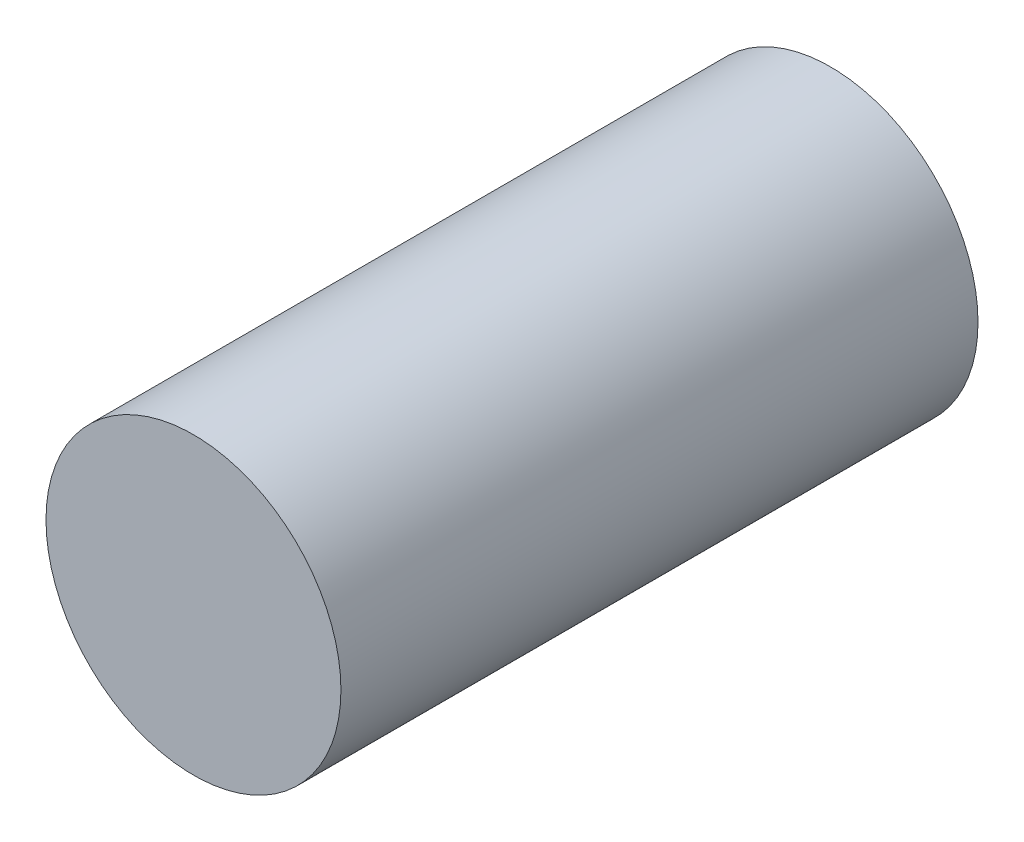
ISO-10303-21;
HEADER;
FILE_DESCRIPTION(('STEP AP214'),'2;1');
FILE_NAME('part.step','',(''),(''),'','','');
FILE_SCHEMA(('AUTOMOTIVE_DESIGN { 1 0 10303 214 1 1 1 1 }'));
ENDSEC;
DATA;
#1=APPLICATION_CONTEXT('core data for automotive mechanical design processes');
#2=APPLICATION_PROTOCOL_DEFINITION('international standard','automotive_design',2000,#1);
#3=PRODUCT_CONTEXT('',#1,'mechanical');
#4=PRODUCT('Part','Part','',(#3));
#5=PRODUCT_RELATED_PRODUCT_CATEGORY('part','',(#4));
#6=PRODUCT_DEFINITION_FORMATION('','',#4);
#7=PRODUCT_DEFINITION_CONTEXT('part definition',#1,'design');
#8=PRODUCT_DEFINITION('design','',#6,#7);
#9=PRODUCT_DEFINITION_SHAPE('','',#8);
#10=(LENGTH_UNIT() NAMED_UNIT(*) SI_UNIT(.MILLI.,.METRE.));
#11=(NAMED_UNIT(*) PLANE_ANGLE_UNIT() SI_UNIT($,.RADIAN.));
#12=(NAMED_UNIT(*) SI_UNIT($,.STERADIAN.) SOLID_ANGLE_UNIT());
#13=UNCERTAINTY_MEASURE_WITH_UNIT(LENGTH_MEASURE(1.E-05),#10,'distance_accuracy_value','');
#14=(GEOMETRIC_REPRESENTATION_CONTEXT(3) GLOBAL_UNCERTAINTY_ASSIGNED_CONTEXT((#13)) GLOBAL_UNIT_ASSIGNED_CONTEXT((#10,
#11,#12)) REPRESENTATION_CONTEXT('',''));
#15=CARTESIAN_POINT('',(0.,0.,0.));
#16=DIRECTION('',(0.,0.,1.));
#17=DIRECTION('',(1.,0.,0.));
#18=AXIS2_PLACEMENT_3D('',#15,#16,#17);
#19=CARTESIAN_POINT('',(-192.5,309.,-10.8));
#20=DIRECTION('',(0.,0.,-1.));
#21=DIRECTION('',(1.,0.,0.));
#22=AXIS2_PLACEMENT_3D('',#19,#20,#21);
#23=PLANE('',#22);
#24=CARTESIAN_POINT('',(-192.5,309.,-10.8));
#25=DIRECTION('',(0.,0.,-1.));
#26=DIRECTION('',(-1.,0.,0.));
#27=AXIS2_PLACEMENT_3D('',#24,#25,#26);
#28=CIRCLE('',#27,2.50000000000003);
#29=CARTESIAN_POINT('',(-195.,309.,-10.8));
#30=VERTEX_POINT('',#29);
#31=EDGE_CURVE('E26',#30,#30,#28,.T.);
#32=ORIENTED_EDGE('',*,*,#31,.T.);
#33=EDGE_LOOP('',(#32));
#34=FACE_BOUND('',#33,.T.);
#35=ADVANCED_FACE('F17',(#34),#23,.T.);
#36=CARTESIAN_POINT('',(-192.5,309.,-10.8));
#37=DIRECTION('',(0.,0.,1.));
#38=DIRECTION('',(-1.,0.,0.));
#39=AXIS2_PLACEMENT_3D('',#36,#37,#38);
#40=CYLINDRICAL_SURFACE('',#39,2.50000000000003);
#41=ORIENTED_EDGE('',*,*,#31,.F.);
#42=EDGE_LOOP('',(#41));
#43=FACE_BOUND('',#42,.T.);
#44=CARTESIAN_POINT('',(-192.5,309.,0.));
#45=DIRECTION('',(0.,0.,1.));
#46=DIRECTION('',(1.,0.,0.));
#47=AXIS2_PLACEMENT_3D('',#44,#45,#46);
#48=CIRCLE('',#47,2.50000000000002);
#49=CARTESIAN_POINT('',(-190.,309.,0.));
#50=VERTEX_POINT('',#49);
#51=EDGE_CURVE('E11',#50,#50,#48,.T.);
#52=ORIENTED_EDGE('',*,*,#51,.F.);
#53=EDGE_LOOP('',(#52));
#54=FACE_BOUND('',#53,.T.);
#55=ADVANCED_FACE('F36',(#43,#54),#40,.T.);
#56=CARTESIAN_POINT('',(-192.5,309.,0.));
#57=DIRECTION('',(0.,0.,-1.));
#58=DIRECTION('',(1.,0.,0.));
#59=AXIS2_PLACEMENT_3D('',#56,#57,#58);
#60=PLANE('',#59);
#61=ORIENTED_EDGE('',*,*,#51,.T.);
#62=EDGE_LOOP('',(#61));
#63=FACE_BOUND('',#62,.T.);
#64=ADVANCED_FACE('F20',(#63),#60,.F.);
#65=CLOSED_SHELL('',(#35,#55,#64));
#66=MANIFOLD_SOLID_BREP('B1',#65);
#67=ADVANCED_BREP_SHAPE_REPRESENTATION('',(#18,#66),#14);
#68=SHAPE_DEFINITION_REPRESENTATION(#9,#67);
ENDSEC;
END-ISO-10303-21;
